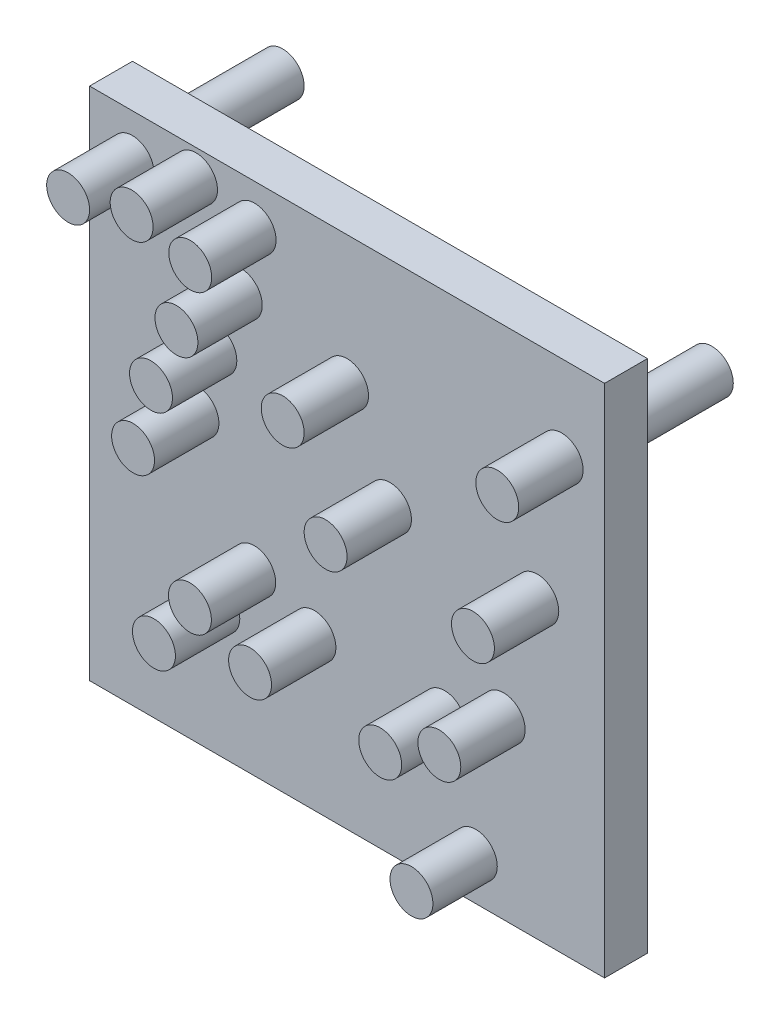
ISO-10303-21;
HEADER;
FILE_DESCRIPTION(('STEP AP214'),'2;1');
FILE_NAME('part.step','',(''),(''),'','','');
FILE_SCHEMA(('AUTOMOTIVE_DESIGN { 1 0 10303 214 1 1 1 1 }'));
ENDSEC;
DATA;
#1=APPLICATION_CONTEXT('core data for automotive mechanical design processes');
#2=APPLICATION_PROTOCOL_DEFINITION('international standard','automotive_design',2000,#1);
#3=PRODUCT_CONTEXT('',#1,'mechanical');
#4=PRODUCT('Part','Part','',(#3));
#5=PRODUCT_RELATED_PRODUCT_CATEGORY('part','',(#4));
#6=PRODUCT_DEFINITION_FORMATION('','',#4);
#7=PRODUCT_DEFINITION_CONTEXT('part definition',#1,'design');
#8=PRODUCT_DEFINITION('design','',#6,#7);
#9=PRODUCT_DEFINITION_SHAPE('','',#8);
#10=(LENGTH_UNIT() NAMED_UNIT(*) SI_UNIT(.MILLI.,.METRE.));
#11=(NAMED_UNIT(*) PLANE_ANGLE_UNIT() SI_UNIT($,.RADIAN.));
#12=(NAMED_UNIT(*) SI_UNIT($,.STERADIAN.) SOLID_ANGLE_UNIT());
#13=UNCERTAINTY_MEASURE_WITH_UNIT(LENGTH_MEASURE(1.E-05),#10,'distance_accuracy_value','');
#14=(GEOMETRIC_REPRESENTATION_CONTEXT(3) GLOBAL_UNCERTAINTY_ASSIGNED_CONTEXT((#13)) GLOBAL_UNIT_ASSIGNED_CONTEXT((#10,
#11,#12)) REPRESENTATION_CONTEXT('',''));
#15=CARTESIAN_POINT('',(0.,0.,0.));
#16=DIRECTION('',(0.,0.,1.));
#17=DIRECTION('',(1.,0.,0.));
#18=AXIS2_PLACEMENT_3D('',#15,#16,#17);
#19=CARTESIAN_POINT('',(0.,0.,10.));
#20=DIRECTION('',(0.,1.,0.));
#21=DIRECTION('',(0.,0.,1.));
#22=AXIS2_PLACEMENT_3D('',#19,#20,#21);
#23=PLANE('',#22);
#24=DIRECTION('',(1.,0.,0.));
#25=VECTOR('',#24,1.);
#26=CARTESIAN_POINT('',(0.,0.,0.));
#27=LINE('',#26,#25);
#28=CARTESIAN_POINT('',(-60.,0.,0.));
#29=VERTEX_POINT('',#28);
#30=CARTESIAN_POINT('',(60.,0.,0.));
#31=VERTEX_POINT('',#30);
#32=EDGE_CURVE('E112',#29,#31,#27,.T.);
#33=ORIENTED_EDGE('',*,*,#32,.T.);
#34=DIRECTION('',(0.,0.,-1.));
#35=VECTOR('',#34,1.);
#36=CARTESIAN_POINT('',(60.,0.,10.));
#37=LINE('',#36,#35);
#38=CARTESIAN_POINT('',(60.,0.,10.));
#39=VERTEX_POINT('',#38);
#40=EDGE_CURVE('E12',#39,#31,#37,.T.);
#41=ORIENTED_EDGE('',*,*,#40,.F.);
#42=DIRECTION('',(1.,0.,0.));
#43=VECTOR('',#42,1.);
#44=CARTESIAN_POINT('',(0.,0.,10.));
#45=LINE('',#44,#43);
#46=CARTESIAN_POINT('',(-60.,0.,10.));
#47=VERTEX_POINT('',#46);
#48=EDGE_CURVE('E94',#47,#39,#45,.T.);
#49=ORIENTED_EDGE('',*,*,#48,.F.);
#50=DIRECTION('',(0.,0.,-1.));
#51=VECTOR('',#50,1.);
#52=CARTESIAN_POINT('',(-60.,0.,10.));
#53=LINE('',#52,#51);
#54=EDGE_CURVE('E61',#47,#29,#53,.T.);
#55=ORIENTED_EDGE('',*,*,#54,.T.);
#56=EDGE_LOOP('',(#33,#41,#49,#55));
#57=FACE_BOUND('',#56,.T.);
#58=ADVANCED_FACE('F44',(#57),#23,.F.);
#59=CARTESIAN_POINT('',(60.,0.,10.));
#60=DIRECTION('',(-1.,0.,0.));
#61=DIRECTION('',(0.,-1.,0.));
#62=AXIS2_PLACEMENT_3D('',#59,#60,#61);
#63=PLANE('',#62);
#64=DIRECTION('',(0.,1.,0.));
#65=VECTOR('',#64,1.);
#66=CARTESIAN_POINT('',(60.,0.,0.));
#67=LINE('',#66,#65);
#68=CARTESIAN_POINT('',(60.,120.,0.));
#69=VERTEX_POINT('',#68);
#70=EDGE_CURVE('E100',#31,#69,#67,.T.);
#71=ORIENTED_EDGE('',*,*,#70,.T.);
#72=DIRECTION('',(0.,0.,-1.));
#73=VECTOR('',#72,1.);
#74=CARTESIAN_POINT('',(60.,120.,10.));
#75=LINE('',#74,#73);
#76=CARTESIAN_POINT('',(60.,120.,10.));
#77=VERTEX_POINT('',#76);
#78=EDGE_CURVE('E53',#77,#69,#75,.T.);
#79=ORIENTED_EDGE('',*,*,#78,.F.);
#80=DIRECTION('',(0.,1.,0.));
#81=VECTOR('',#80,1.);
#82=CARTESIAN_POINT('',(60.,0.,10.));
#83=LINE('',#82,#81);
#84=EDGE_CURVE('E86',#39,#77,#83,.T.);
#85=ORIENTED_EDGE('',*,*,#84,.F.);
#86=ORIENTED_EDGE('',*,*,#40,.T.);
#87=EDGE_LOOP('',(#71,#79,#85,#86));
#88=FACE_BOUND('',#87,.T.);
#89=ADVANCED_FACE('F99',(#88),#63,.F.);
#90=CARTESIAN_POINT('',(0.,120.,10.));
#91=DIRECTION('',(0.,1.,0.));
#92=DIRECTION('',(0.,0.,1.));
#93=AXIS2_PLACEMENT_3D('',#90,#91,#92);
#94=PLANE('',#93);
#95=DIRECTION('',(1.,0.,0.));
#96=VECTOR('',#95,1.);
#97=CARTESIAN_POINT('',(0.,120.,0.));
#98=LINE('',#97,#96);
#99=CARTESIAN_POINT('',(-60.,120.,0.));
#100=VERTEX_POINT('',#99);
#101=EDGE_CURVE('E118',#100,#69,#98,.T.);
#102=ORIENTED_EDGE('',*,*,#101,.F.);
#103=DIRECTION('',(0.,0.,-1.));
#104=VECTOR('',#103,1.);
#105=CARTESIAN_POINT('',(-60.,120.,10.));
#106=LINE('',#105,#104);
#107=CARTESIAN_POINT('',(-60.,120.,10.));
#108=VERTEX_POINT('',#107);
#109=EDGE_CURVE('E75',#108,#100,#106,.T.);
#110=ORIENTED_EDGE('',*,*,#109,.F.);
#111=DIRECTION('',(1.,0.,0.));
#112=VECTOR('',#111,1.);
#113=CARTESIAN_POINT('',(0.,120.,10.));
#114=LINE('',#113,#112);
#115=EDGE_CURVE('E93',#108,#77,#114,.T.);
#116=ORIENTED_EDGE('',*,*,#115,.T.);
#117=ORIENTED_EDGE('',*,*,#78,.T.);
#118=EDGE_LOOP('',(#102,#110,#116,#117));
#119=FACE_BOUND('',#118,.T.);
#120=ADVANCED_FACE('F104',(#119),#94,.T.);
#121=CARTESIAN_POINT('',(-60.,0.,10.));
#122=DIRECTION('',(-1.,0.,0.));
#123=DIRECTION('',(0.,0.,1.));
#124=AXIS2_PLACEMENT_3D('',#121,#122,#123);
#125=PLANE('',#124);
#126=DIRECTION('',(0.,1.,0.));
#127=VECTOR('',#126,1.);
#128=CARTESIAN_POINT('',(-60.,0.,0.));
#129=LINE('',#128,#127);
#130=EDGE_CURVE('E121',#29,#100,#129,.T.);
#131=ORIENTED_EDGE('',*,*,#130,.F.);
#132=ORIENTED_EDGE('',*,*,#54,.F.);
#133=DIRECTION('',(0.,1.,0.));
#134=VECTOR('',#133,1.);
#135=CARTESIAN_POINT('',(-60.,0.,10.));
#136=LINE('',#135,#134);
#137=EDGE_CURVE('E106',#47,#108,#136,.T.);
#138=ORIENTED_EDGE('',*,*,#137,.T.);
#139=ORIENTED_EDGE('',*,*,#109,.T.);
#140=EDGE_LOOP('',(#131,#132,#138,#139));
#141=FACE_BOUND('',#140,.T.);
#142=ADVANCED_FACE('F328',(#141),#125,.T.);
#143=CARTESIAN_POINT('',(0.,0.,10.));
#144=DIRECTION('',(0.,0.,1.));
#145=DIRECTION('',(1.,0.,0.));
#146=AXIS2_PLACEMENT_3D('',#143,#144,#145);
#147=PLANE('',#146);
#148=CARTESIAN_POINT('',(30.,10.,10.));
#149=DIRECTION('',(0.,0.,1.));
#150=DIRECTION('',(1.,0.,0.));
#151=AXIS2_PLACEMENT_3D('',#148,#149,#150);
#152=CIRCLE('',#151,5.);
#153=CARTESIAN_POINT('',(35.,10.,10.));
#154=VERTEX_POINT('',#153);
#155=EDGE_CURVE('E298',#154,#154,#152,.F.);
#156=ORIENTED_EDGE('',*,*,#155,.T.);
#157=EDGE_LOOP('',(#156));
#158=FACE_BOUND('',#157,.T.);
#159=CARTESIAN_POINT('',(-30.,30.,10.));
#160=DIRECTION('',(0.,0.,1.));
#161=DIRECTION('',(1.,0.,0.));
#162=AXIS2_PLACEMENT_3D('',#159,#160,#161);
#163=CIRCLE('',#162,5.);
#164=CARTESIAN_POINT('',(-25.,30.,10.));
#165=VERTEX_POINT('',#164);
#166=EDGE_CURVE('E290',#165,#165,#163,.F.);
#167=ORIENTED_EDGE('',*,*,#166,.T.);
#168=EDGE_LOOP('',(#167));
#169=FACE_BOUND('',#168,.T.);
#170=CARTESIAN_POINT('',(9.99999999999999,70.,10.));
#171=DIRECTION('',(0.,0.,1.));
#172=DIRECTION('',(1.,0.,0.));
#173=AXIS2_PLACEMENT_3D('',#170,#171,#172);
#174=CIRCLE('',#173,5.);
#175=CARTESIAN_POINT('',(15.,70.,10.));
#176=VERTEX_POINT('',#175);
#177=EDGE_CURVE('E282',#176,#176,#174,.F.);
#178=ORIENTED_EDGE('',*,*,#177,.T.);
#179=EDGE_LOOP('',(#178));
#180=FACE_BOUND('',#179,.T.);
#181=CARTESIAN_POINT('',(0.,90.,10.));
#182=DIRECTION('',(0.,0.,1.));
#183=DIRECTION('',(1.,0.,0.));
#184=AXIS2_PLACEMENT_3D('',#181,#182,#183);
#185=CIRCLE('',#184,5.);
#186=CARTESIAN_POINT('',(5.,90.,10.));
#187=VERTEX_POINT('',#186);
#188=EDGE_CURVE('E274',#187,#187,#185,.F.);
#189=ORIENTED_EDGE('',*,*,#188,.T.);
#190=EDGE_LOOP('',(#189));
#191=FACE_BOUND('',#190,.T.);
#192=CARTESIAN_POINT('',(50.,100.,10.));
#193=DIRECTION('',(0.,0.,1.));
#194=DIRECTION('',(1.,0.,0.));
#195=AXIS2_PLACEMENT_3D('',#192,#193,#194);
#196=CIRCLE('',#195,5.);
#197=CARTESIAN_POINT('',(55.,100.,10.));
#198=VERTEX_POINT('',#197);
#199=EDGE_CURVE('E263',#198,#198,#196,.F.);
#200=ORIENTED_EDGE('',*,*,#199,.T.);
#201=EDGE_LOOP('',(#200));
#202=FACE_BOUND('',#201,.T.);
#203=CARTESIAN_POINT('',(44.3298197100217,68.6697516132972,10.));
#204=DIRECTION('',(0.,0.,1.));
#205=DIRECTION('',(1.,0.,0.));
#206=AXIS2_PLACEMENT_3D('',#203,#204,#205);
#207=CIRCLE('',#206,5.);
#208=CARTESIAN_POINT('',(49.3298197100217,68.6697516132972,10.));
#209=VERTEX_POINT('',#208);
#210=EDGE_CURVE('E218',#209,#209,#207,.F.);
#211=ORIENTED_EDGE('',*,*,#210,.T.);
#212=EDGE_LOOP('',(#211));
#213=FACE_BOUND('',#212,.T.);
#214=CARTESIAN_POINT('',(36.4985126122183,40.8091264864685,10.));
#215=DIRECTION('',(0.,0.,1.));
#216=DIRECTION('',(1.,0.,0.));
#217=AXIS2_PLACEMENT_3D('',#214,#215,#216);
#218=CIRCLE('',#217,5.);
#219=CARTESIAN_POINT('',(41.4985126122183,40.8091264864685,10.));
#220=VERTEX_POINT('',#219);
#221=EDGE_CURVE('E210',#220,#220,#218,.F.);
#222=ORIENTED_EDGE('',*,*,#221,.T.);
#223=EDGE_LOOP('',(#222));
#224=FACE_BOUND('',#223,.T.);
#225=CARTESIAN_POINT('',(22.7242044659963,34.370237865555,10.));
#226=DIRECTION('',(0.,0.,1.));
#227=DIRECTION('',(1.,0.,0.));
#228=AXIS2_PLACEMENT_3D('',#225,#226,#227);
#229=CIRCLE('',#228,5.);
#230=CARTESIAN_POINT('',(27.7242044659963,34.370237865555,10.));
#231=VERTEX_POINT('',#230);
#232=EDGE_CURVE('E202',#231,#231,#229,.F.);
#233=ORIENTED_EDGE('',*,*,#232,.T.);
#234=EDGE_LOOP('',(#233));
#235=FACE_BOUND('',#234,.T.);
#236=CARTESIAN_POINT('',(-7.60428553656016,35.3574267709437,10.));
#237=DIRECTION('',(0.,0.,1.));
#238=DIRECTION('',(1.,0.,0.));
#239=AXIS2_PLACEMENT_3D('',#236,#237,#238);
#240=CIRCLE('',#239,5.);
#241=CARTESIAN_POINT('',(-2.60428553656016,35.3574267709437,10.));
#242=VERTEX_POINT('',#241);
#243=EDGE_CURVE('E194',#242,#242,#240,.F.);
#244=ORIENTED_EDGE('',*,*,#243,.T.);
#245=EDGE_LOOP('',(#244));
#246=FACE_BOUND('',#245,.T.);
#247=CARTESIAN_POINT('',(-21.6175660857106,41.4427877076755,10.));
#248=DIRECTION('',(0.,0.,1.));
#249=DIRECTION('',(1.,0.,0.));
#250=AXIS2_PLACEMENT_3D('',#247,#248,#249);
#251=CIRCLE('',#250,5.);
#252=CARTESIAN_POINT('',(-16.6175660857106,41.4427877076755,10.));
#253=VERTEX_POINT('',#252);
#254=EDGE_CURVE('E186',#253,#253,#251,.F.);
#255=ORIENTED_EDGE('',*,*,#254,.T.);
#256=EDGE_LOOP('',(#255));
#257=FACE_BOUND('',#256,.T.);
#258=CARTESIAN_POINT('',(-34.8661665493023,66.9958826532401,10.));
#259=DIRECTION('',(0.,0.,1.));
#260=DIRECTION('',(1.,0.,0.));
#261=AXIS2_PLACEMENT_3D('',#258,#259,#260);
#262=CIRCLE('',#261,5.);
#263=CARTESIAN_POINT('',(-29.8661665493023,66.9958826532401,10.));
#264=VERTEX_POINT('',#263);
#265=EDGE_CURVE('E178',#264,#264,#262,.F.);
#266=ORIENTED_EDGE('',*,*,#265,.T.);
#267=EDGE_LOOP('',(#266));
#268=FACE_BOUND('',#267,.T.);
#269=CARTESIAN_POINT('',(-30.6879393988327,81.7091684461313,10.));
#270=DIRECTION('',(0.,0.,1.));
#271=DIRECTION('',(1.,0.,0.));
#272=AXIS2_PLACEMENT_3D('',#269,#270,#271);
#273=CIRCLE('',#272,5.);
#274=CARTESIAN_POINT('',(-25.6879393988327,81.7091684461313,10.));
#275=VERTEX_POINT('',#274);
#276=EDGE_CURVE('E170',#275,#275,#273,.F.);
#277=ORIENTED_EDGE('',*,*,#276,.T.);
#278=EDGE_LOOP('',(#277));
#279=FACE_BOUND('',#278,.T.);
#280=CARTESIAN_POINT('',(-24.7616586979105,95.8463157387056,10.));
#281=DIRECTION('',(0.,0.,1.));
#282=DIRECTION('',(1.,0.,0.));
#283=AXIS2_PLACEMENT_3D('',#280,#281,#282);
#284=CIRCLE('',#283,5.);
#285=CARTESIAN_POINT('',(-19.7616586979105,95.8463157387056,10.));
#286=VERTEX_POINT('',#285);
#287=EDGE_CURVE('E162',#286,#286,#284,.F.);
#288=ORIENTED_EDGE('',*,*,#287,.T.);
#289=EDGE_LOOP('',(#288));
#290=FACE_BOUND('',#289,.T.);
#291=CARTESIAN_POINT('',(-21.5409169620148,110.590393391575,10.));
#292=DIRECTION('',(0.,0.,1.));
#293=DIRECTION('',(1.,0.,0.));
#294=AXIS2_PLACEMENT_3D('',#291,#292,#293);
#295=CIRCLE('',#294,5.);
#296=CARTESIAN_POINT('',(-16.5409169620148,110.590393391575,10.));
#297=VERTEX_POINT('',#296);
#298=EDGE_CURVE('E154',#297,#297,#295,.F.);
#299=ORIENTED_EDGE('',*,*,#298,.T.);
#300=EDGE_LOOP('',(#299));
#301=FACE_BOUND('',#300,.T.);
#302=CARTESIAN_POINT('',(-35.1957143398213,113.933430283722,10.));
#303=DIRECTION('',(0.,0.,1.));
#304=DIRECTION('',(1.,0.,0.));
#305=AXIS2_PLACEMENT_3D('',#302,#303,#304);
#306=CIRCLE('',#305,5.);
#307=CARTESIAN_POINT('',(-30.1957143398213,113.933430283722,10.));
#308=VERTEX_POINT('',#307);
#309=EDGE_CURVE('E143',#308,#308,#306,.F.);
#310=ORIENTED_EDGE('',*,*,#309,.T.);
#311=EDGE_LOOP('',(#310));
#312=FACE_BOUND('',#311,.T.);
#313=CARTESIAN_POINT('',(-50.,110.,10.));
#314=DIRECTION('',(0.,0.,1.));
#315=DIRECTION('',(1.,0.,0.));
#316=AXIS2_PLACEMENT_3D('',#313,#314,#315);
#317=CIRCLE('',#316,5.);
#318=CARTESIAN_POINT('',(-45.,110.,10.));
#319=VERTEX_POINT('',#318);
#320=EDGE_CURVE('E115',#319,#319,#317,.F.);
#321=ORIENTED_EDGE('',*,*,#320,.T.);
#322=EDGE_LOOP('',(#321));
#323=FACE_BOUND('',#322,.T.);
#324=ORIENTED_EDGE('',*,*,#48,.T.);
#325=ORIENTED_EDGE('',*,*,#84,.T.);
#326=ORIENTED_EDGE('',*,*,#115,.F.);
#327=ORIENTED_EDGE('',*,*,#137,.F.);
#328=EDGE_LOOP('',(#324,#325,#326,#327));
#329=FACE_BOUND('',#328,.T.);
#330=ADVANCED_FACE('F90',(#158,#169,#180,#191,#202,#213,#224,#235,#246,#257,#268,#279,#290,#301,
#312,#323,#329),#147,.T.);
#331=CARTESIAN_POINT('',(0.,0.,0.));
#332=DIRECTION('',(0.,0.,1.));
#333=DIRECTION('',(1.,0.,0.));
#334=AXIS2_PLACEMENT_3D('',#331,#332,#333);
#335=PLANE('',#334);
#336=CARTESIAN_POINT('',(30.,10.,0.));
#337=DIRECTION('',(0.,0.,1.));
#338=DIRECTION('',(1.,0.,0.));
#339=AXIS2_PLACEMENT_3D('',#336,#337,#338);
#340=CIRCLE('',#339,5.);
#341=CARTESIAN_POINT('',(35.,10.,0.));
#342=VERTEX_POINT('',#341);
#343=EDGE_CURVE('E259',#342,#342,#340,.T.);
#344=ORIENTED_EDGE('',*,*,#343,.T.);
#345=EDGE_LOOP('',(#344));
#346=FACE_BOUND('',#345,.T.);
#347=CARTESIAN_POINT('',(-30.,30.,0.));
#348=DIRECTION('',(0.,0.,1.));
#349=DIRECTION('',(1.,0.,0.));
#350=AXIS2_PLACEMENT_3D('',#347,#348,#349);
#351=CIRCLE('',#350,5.);
#352=CARTESIAN_POINT('',(-25.,30.,0.));
#353=VERTEX_POINT('',#352);
#354=EDGE_CURVE('E251',#353,#353,#351,.T.);
#355=ORIENTED_EDGE('',*,*,#354,.T.);
#356=EDGE_LOOP('',(#355));
#357=FACE_BOUND('',#356,.T.);
#358=CARTESIAN_POINT('',(9.99999999999999,70.,0.));
#359=DIRECTION('',(0.,0.,1.));
#360=DIRECTION('',(1.,0.,0.));
#361=AXIS2_PLACEMENT_3D('',#358,#359,#360);
#362=CIRCLE('',#361,5.);
#363=CARTESIAN_POINT('',(15.,70.,0.));
#364=VERTEX_POINT('',#363);
#365=EDGE_CURVE('E243',#364,#364,#362,.T.);
#366=ORIENTED_EDGE('',*,*,#365,.T.);
#367=EDGE_LOOP('',(#366));
#368=FACE_BOUND('',#367,.T.);
#369=CARTESIAN_POINT('',(0.,90.,0.));
#370=DIRECTION('',(0.,0.,1.));
#371=DIRECTION('',(1.,0.,0.));
#372=AXIS2_PLACEMENT_3D('',#369,#370,#371);
#373=CIRCLE('',#372,5.);
#374=CARTESIAN_POINT('',(4.99999999999999,90.,0.));
#375=VERTEX_POINT('',#374);
#376=EDGE_CURVE('E235',#375,#375,#373,.T.);
#377=ORIENTED_EDGE('',*,*,#376,.T.);
#378=EDGE_LOOP('',(#377));
#379=FACE_BOUND('',#378,.T.);
#380=CARTESIAN_POINT('',(50.,100.,0.));
#381=DIRECTION('',(0.,0.,1.));
#382=DIRECTION('',(1.,0.,0.));
#383=AXIS2_PLACEMENT_3D('',#380,#381,#382);
#384=CIRCLE('',#383,5.);
#385=CARTESIAN_POINT('',(55.,100.,0.));
#386=VERTEX_POINT('',#385);
#387=EDGE_CURVE('E227',#386,#386,#384,.T.);
#388=ORIENTED_EDGE('',*,*,#387,.T.);
#389=EDGE_LOOP('',(#388));
#390=FACE_BOUND('',#389,.T.);
#391=CARTESIAN_POINT('',(-50.,110.,0.));
#392=DIRECTION('',(0.,0.,1.));
#393=DIRECTION('',(1.,0.,0.));
#394=AXIS2_PLACEMENT_3D('',#391,#392,#393);
#395=CIRCLE('',#394,5.);
#396=CARTESIAN_POINT('',(-45.,110.,0.));
#397=VERTEX_POINT('',#396);
#398=EDGE_CURVE('E139',#397,#397,#395,.T.);
#399=ORIENTED_EDGE('',*,*,#398,.T.);
#400=EDGE_LOOP('',(#399));
#401=FACE_BOUND('',#400,.T.);
#402=ORIENTED_EDGE('',*,*,#32,.F.);
#403=ORIENTED_EDGE('',*,*,#130,.T.);
#404=ORIENTED_EDGE('',*,*,#101,.T.);
#405=ORIENTED_EDGE('',*,*,#70,.F.);
#406=EDGE_LOOP('',(#402,#403,#404,#405));
#407=FACE_BOUND('',#406,.T.);
#408=ADVANCED_FACE('F327',(#346,#357,#368,#379,#390,#401,#407),#335,.F.);
#409=CARTESIAN_POINT('',(-50.,110.,25.));
#410=DIRECTION('',(0.,0.,-1.));
#411=DIRECTION('',(-1.,0.,0.));
#412=AXIS2_PLACEMENT_3D('',#409,#410,#411);
#413=CYLINDRICAL_SURFACE('',#412,5.);
#414=ORIENTED_EDGE('',*,*,#320,.F.);
#415=EDGE_LOOP('',(#414));
#416=FACE_BOUND('',#415,.T.);
#417=CARTESIAN_POINT('',(-50.,110.,25.));
#418=DIRECTION('',(0.,0.,1.));
#419=DIRECTION('',(1.,0.,0.));
#420=AXIS2_PLACEMENT_3D('',#417,#418,#419);
#421=CIRCLE('',#420,5.);
#422=CARTESIAN_POINT('',(-45.,110.,25.));
#423=VERTEX_POINT('',#422);
#424=EDGE_CURVE('E134',#423,#423,#421,.T.);
#425=ORIENTED_EDGE('',*,*,#424,.F.);
#426=EDGE_LOOP('',(#425));
#427=FACE_BOUND('',#426,.T.);
#428=ADVANCED_FACE('F340',(#416,#427),#413,.T.);
#429=CARTESIAN_POINT('',(0.,0.,25.));
#430=DIRECTION('',(0.,0.,1.));
#431=DIRECTION('',(1.,0.,0.));
#432=AXIS2_PLACEMENT_3D('',#429,#430,#431);
#433=PLANE('',#432);
#434=ORIENTED_EDGE('',*,*,#424,.T.);
#435=EDGE_LOOP('',(#434));
#436=FACE_BOUND('',#435,.T.);
#437=ADVANCED_FACE('F345',(#436),#433,.T.);
#438=CARTESIAN_POINT('',(-50.,110.,-25.));
#439=DIRECTION('',(0.,0.,1.));
#440=DIRECTION('',(1.,0.,0.));
#441=AXIS2_PLACEMENT_3D('',#438,#439,#440);
#442=CYLINDRICAL_SURFACE('',#441,5.);
#443=CARTESIAN_POINT('',(-50.,110.,-25.));
#444=DIRECTION('',(0.,0.,1.));
#445=DIRECTION('',(1.,0.,0.));
#446=AXIS2_PLACEMENT_3D('',#443,#444,#445);
#447=CIRCLE('',#446,5.);
#448=CARTESIAN_POINT('',(-45.,110.,-25.));
#449=VERTEX_POINT('',#448);
#450=EDGE_CURVE('E138',#449,#449,#447,.T.);
#451=ORIENTED_EDGE('',*,*,#450,.T.);
#452=EDGE_LOOP('',(#451));
#453=FACE_BOUND('',#452,.T.);
#454=ORIENTED_EDGE('',*,*,#398,.F.);
#455=EDGE_LOOP('',(#454));
#456=FACE_BOUND('',#455,.T.);
#457=ADVANCED_FACE('F349',(#453,#456),#442,.T.);
#458=CARTESIAN_POINT('',(0.,0.,-25.));
#459=DIRECTION('',(0.,0.,-1.));
#460=DIRECTION('',(1.,0.,0.));
#461=AXIS2_PLACEMENT_3D('',#458,#459,#460);
#462=PLANE('',#461);
#463=ORIENTED_EDGE('',*,*,#450,.F.);
#464=EDGE_LOOP('',(#463));
#465=FACE_BOUND('',#464,.T.);
#466=ADVANCED_FACE('F353',(#465),#462,.T.);
#467=CARTESIAN_POINT('',(-35.1957143398213,113.933430283722,25.));
#468=DIRECTION('',(0.,0.,-1.));
#469=DIRECTION('',(-1.,0.,0.));
#470=AXIS2_PLACEMENT_3D('',#467,#468,#469);
#471=CYLINDRICAL_SURFACE('',#470,5.);
#472=ORIENTED_EDGE('',*,*,#309,.F.);
#473=EDGE_LOOP('',(#472));
#474=FACE_BOUND('',#473,.T.);
#475=CARTESIAN_POINT('',(-35.1957143398213,113.933430283722,25.));
#476=DIRECTION('',(0.,0.,1.));
#477=DIRECTION('',(1.,0.,0.));
#478=AXIS2_PLACEMENT_3D('',#475,#476,#477);
#479=CIRCLE('',#478,5.);
#480=CARTESIAN_POINT('',(-30.1957143398213,113.933430283722,25.));
#481=VERTEX_POINT('',#480);
#482=EDGE_CURVE('E150',#481,#481,#479,.T.);
#483=ORIENTED_EDGE('',*,*,#482,.F.);
#484=EDGE_LOOP('',(#483));
#485=FACE_BOUND('',#484,.T.);
#486=ADVANCED_FACE('F357',(#474,#485),#471,.T.);
#487=CARTESIAN_POINT('',(14.8042856601787,3.93343028372205,25.));
#488=DIRECTION('',(0.,0.,1.));
#489=DIRECTION('',(1.,0.,0.));
#490=AXIS2_PLACEMENT_3D('',#487,#488,#489);
#491=PLANE('',#490);
#492=ORIENTED_EDGE('',*,*,#482,.T.);
#493=EDGE_LOOP('',(#492));
#494=FACE_BOUND('',#493,.T.);
#495=ADVANCED_FACE('F361',(#494),#491,.T.);
#496=CARTESIAN_POINT('',(-21.5409169620148,110.590393391575,25.));
#497=DIRECTION('',(0.,0.,-1.));
#498=DIRECTION('',(-1.,0.,0.));
#499=AXIS2_PLACEMENT_3D('',#496,#497,#498);
#500=CYLINDRICAL_SURFACE('',#499,5.);
#501=ORIENTED_EDGE('',*,*,#298,.F.);
#502=EDGE_LOOP('',(#501));
#503=FACE_BOUND('',#502,.T.);
#504=CARTESIAN_POINT('',(-21.5409169620148,110.590393391575,25.));
#505=DIRECTION('',(0.,0.,1.));
#506=DIRECTION('',(1.,0.,0.));
#507=AXIS2_PLACEMENT_3D('',#504,#505,#506);
#508=CIRCLE('',#507,5.);
#509=CARTESIAN_POINT('',(-16.5409169620148,110.590393391575,25.));
#510=VERTEX_POINT('',#509);
#511=EDGE_CURVE('E158',#510,#510,#508,.T.);
#512=ORIENTED_EDGE('',*,*,#511,.F.);
#513=EDGE_LOOP('',(#512));
#514=FACE_BOUND('',#513,.T.);
#515=ADVANCED_FACE('F365',(#503,#514),#500,.T.);
#516=CARTESIAN_POINT('',(28.4590830379852,0.590393391575031,25.));
#517=DIRECTION('',(0.,0.,1.));
#518=DIRECTION('',(1.,0.,0.));
#519=AXIS2_PLACEMENT_3D('',#516,#517,#518);
#520=PLANE('',#519);
#521=ORIENTED_EDGE('',*,*,#511,.T.);
#522=EDGE_LOOP('',(#521));
#523=FACE_BOUND('',#522,.T.);
#524=ADVANCED_FACE('F369',(#523),#520,.T.);
#525=CARTESIAN_POINT('',(-24.7616586979105,95.8463157387056,25.));
#526=DIRECTION('',(0.,0.,-1.));
#527=DIRECTION('',(-1.,0.,0.));
#528=AXIS2_PLACEMENT_3D('',#525,#526,#527);
#529=CYLINDRICAL_SURFACE('',#528,5.);
#530=ORIENTED_EDGE('',*,*,#287,.F.);
#531=EDGE_LOOP('',(#530));
#532=FACE_BOUND('',#531,.T.);
#533=CARTESIAN_POINT('',(-24.7616586979105,95.8463157387056,25.));
#534=DIRECTION('',(0.,0.,1.));
#535=DIRECTION('',(1.,0.,0.));
#536=AXIS2_PLACEMENT_3D('',#533,#534,#535);
#537=CIRCLE('',#536,5.);
#538=CARTESIAN_POINT('',(-19.7616586979105,95.8463157387056,25.));
#539=VERTEX_POINT('',#538);
#540=EDGE_CURVE('E166',#539,#539,#537,.T.);
#541=ORIENTED_EDGE('',*,*,#540,.F.);
#542=EDGE_LOOP('',(#541));
#543=FACE_BOUND('',#542,.T.);
#544=ADVANCED_FACE('F373',(#532,#543),#529,.T.);
#545=CARTESIAN_POINT('',(25.2383413020895,-14.1536842612944,25.));
#546=DIRECTION('',(0.,0.,1.));
#547=DIRECTION('',(1.,0.,0.));
#548=AXIS2_PLACEMENT_3D('',#545,#546,#547);
#549=PLANE('',#548);
#550=ORIENTED_EDGE('',*,*,#540,.T.);
#551=EDGE_LOOP('',(#550));
#552=FACE_BOUND('',#551,.T.);
#553=ADVANCED_FACE('F377',(#552),#549,.T.);
#554=CARTESIAN_POINT('',(-30.6879393988327,81.7091684461313,25.));
#555=DIRECTION('',(0.,0.,-1.));
#556=DIRECTION('',(-1.,0.,0.));
#557=AXIS2_PLACEMENT_3D('',#554,#555,#556);
#558=CYLINDRICAL_SURFACE('',#557,5.);
#559=ORIENTED_EDGE('',*,*,#276,.F.);
#560=EDGE_LOOP('',(#559));
#561=FACE_BOUND('',#560,.T.);
#562=CARTESIAN_POINT('',(-30.6879393988327,81.7091684461313,25.));
#563=DIRECTION('',(0.,0.,1.));
#564=DIRECTION('',(1.,0.,0.));
#565=AXIS2_PLACEMENT_3D('',#562,#563,#564);
#566=CIRCLE('',#565,5.);
#567=CARTESIAN_POINT('',(-25.6879393988327,81.7091684461313,25.));
#568=VERTEX_POINT('',#567);
#569=EDGE_CURVE('E174',#568,#568,#566,.T.);
#570=ORIENTED_EDGE('',*,*,#569,.F.);
#571=EDGE_LOOP('',(#570));
#572=FACE_BOUND('',#571,.T.);
#573=ADVANCED_FACE('F381',(#561,#572),#558,.T.);
#574=CARTESIAN_POINT('',(19.3120606011673,-28.2908315538687,25.));
#575=DIRECTION('',(0.,0.,1.));
#576=DIRECTION('',(1.,0.,0.));
#577=AXIS2_PLACEMENT_3D('',#574,#575,#576);
#578=PLANE('',#577);
#579=ORIENTED_EDGE('',*,*,#569,.T.);
#580=EDGE_LOOP('',(#579));
#581=FACE_BOUND('',#580,.T.);
#582=ADVANCED_FACE('F385',(#581),#578,.T.);
#583=CARTESIAN_POINT('',(-34.8661665493023,66.9958826532401,25.));
#584=DIRECTION('',(0.,0.,-1.));
#585=DIRECTION('',(-1.,0.,0.));
#586=AXIS2_PLACEMENT_3D('',#583,#584,#585);
#587=CYLINDRICAL_SURFACE('',#586,5.);
#588=ORIENTED_EDGE('',*,*,#265,.F.);
#589=EDGE_LOOP('',(#588));
#590=FACE_BOUND('',#589,.T.);
#591=CARTESIAN_POINT('',(-34.8661665493023,66.9958826532401,25.));
#592=DIRECTION('',(0.,0.,1.));
#593=DIRECTION('',(1.,0.,0.));
#594=AXIS2_PLACEMENT_3D('',#591,#592,#593);
#595=CIRCLE('',#594,5.);
#596=CARTESIAN_POINT('',(-29.8661665493023,66.9958826532401,25.));
#597=VERTEX_POINT('',#596);
#598=EDGE_CURVE('E182',#597,#597,#595,.T.);
#599=ORIENTED_EDGE('',*,*,#598,.F.);
#600=EDGE_LOOP('',(#599));
#601=FACE_BOUND('',#600,.T.);
#602=ADVANCED_FACE('F389',(#590,#601),#587,.T.);
#603=CARTESIAN_POINT('',(15.1338334506977,-43.0041173467599,25.));
#604=DIRECTION('',(0.,0.,1.));
#605=DIRECTION('',(1.,0.,0.));
#606=AXIS2_PLACEMENT_3D('',#603,#604,#605);
#607=PLANE('',#606);
#608=ORIENTED_EDGE('',*,*,#598,.T.);
#609=EDGE_LOOP('',(#608));
#610=FACE_BOUND('',#609,.T.);
#611=ADVANCED_FACE('F393',(#610),#607,.T.);
#612=CARTESIAN_POINT('',(-21.6175660857106,41.4427877076755,25.));
#613=DIRECTION('',(0.,0.,-1.));
#614=DIRECTION('',(-1.,0.,0.));
#615=AXIS2_PLACEMENT_3D('',#612,#613,#614);
#616=CYLINDRICAL_SURFACE('',#615,5.);
#617=ORIENTED_EDGE('',*,*,#254,.F.);
#618=EDGE_LOOP('',(#617));
#619=FACE_BOUND('',#618,.T.);
#620=CARTESIAN_POINT('',(-21.6175660857106,41.4427877076755,25.));
#621=DIRECTION('',(0.,0.,1.));
#622=DIRECTION('',(1.,0.,0.));
#623=AXIS2_PLACEMENT_3D('',#620,#621,#622);
#624=CIRCLE('',#623,5.);
#625=CARTESIAN_POINT('',(-16.6175660857106,41.4427877076755,25.));
#626=VERTEX_POINT('',#625);
#627=EDGE_CURVE('E190',#626,#626,#624,.T.);
#628=ORIENTED_EDGE('',*,*,#627,.F.);
#629=EDGE_LOOP('',(#628));
#630=FACE_BOUND('',#629,.T.);
#631=ADVANCED_FACE('F397',(#619,#630),#616,.T.);
#632=CARTESIAN_POINT('',(28.3824339142894,-68.5572122923245,25.));
#633=DIRECTION('',(0.,0.,1.));
#634=DIRECTION('',(1.,0.,0.));
#635=AXIS2_PLACEMENT_3D('',#632,#633,#634);
#636=PLANE('',#635);
#637=ORIENTED_EDGE('',*,*,#627,.T.);
#638=EDGE_LOOP('',(#637));
#639=FACE_BOUND('',#638,.T.);
#640=ADVANCED_FACE('F401',(#639),#636,.T.);
#641=CARTESIAN_POINT('',(-7.60428553656016,35.3574267709437,25.));
#642=DIRECTION('',(0.,0.,-1.));
#643=DIRECTION('',(-1.,0.,0.));
#644=AXIS2_PLACEMENT_3D('',#641,#642,#643);
#645=CYLINDRICAL_SURFACE('',#644,5.);
#646=ORIENTED_EDGE('',*,*,#243,.F.);
#647=EDGE_LOOP('',(#646));
#648=FACE_BOUND('',#647,.T.);
#649=CARTESIAN_POINT('',(-7.60428553656016,35.3574267709437,25.));
#650=DIRECTION('',(0.,0.,1.));
#651=DIRECTION('',(1.,0.,0.));
#652=AXIS2_PLACEMENT_3D('',#649,#650,#651);
#653=CIRCLE('',#652,5.);
#654=CARTESIAN_POINT('',(-2.60428553656016,35.3574267709437,25.));
#655=VERTEX_POINT('',#654);
#656=EDGE_CURVE('E198',#655,#655,#653,.T.);
#657=ORIENTED_EDGE('',*,*,#656,.F.);
#658=EDGE_LOOP('',(#657));
#659=FACE_BOUND('',#658,.T.);
#660=ADVANCED_FACE('F405',(#648,#659),#645,.T.);
#661=CARTESIAN_POINT('',(42.3957144634398,-74.6425732290564,25.));
#662=DIRECTION('',(0.,0.,1.));
#663=DIRECTION('',(1.,0.,0.));
#664=AXIS2_PLACEMENT_3D('',#661,#662,#663);
#665=PLANE('',#664);
#666=ORIENTED_EDGE('',*,*,#656,.T.);
#667=EDGE_LOOP('',(#666));
#668=FACE_BOUND('',#667,.T.);
#669=ADVANCED_FACE('F409',(#668),#665,.T.);
#670=CARTESIAN_POINT('',(22.7242044659963,34.370237865555,25.));
#671=DIRECTION('',(0.,0.,-1.));
#672=DIRECTION('',(-1.,0.,0.));
#673=AXIS2_PLACEMENT_3D('',#670,#671,#672);
#674=CYLINDRICAL_SURFACE('',#673,5.);
#675=ORIENTED_EDGE('',*,*,#232,.F.);
#676=EDGE_LOOP('',(#675));
#677=FACE_BOUND('',#676,.T.);
#678=CARTESIAN_POINT('',(22.7242044659963,34.370237865555,25.));
#679=DIRECTION('',(0.,0.,1.));
#680=DIRECTION('',(1.,0.,0.));
#681=AXIS2_PLACEMENT_3D('',#678,#679,#680);
#682=CIRCLE('',#681,5.);
#683=CARTESIAN_POINT('',(27.7242044659963,34.370237865555,25.));
#684=VERTEX_POINT('',#683);
#685=EDGE_CURVE('E206',#684,#684,#682,.T.);
#686=ORIENTED_EDGE('',*,*,#685,.F.);
#687=EDGE_LOOP('',(#686));
#688=FACE_BOUND('',#687,.T.);
#689=ADVANCED_FACE('F413',(#677,#688),#674,.T.);
#690=CARTESIAN_POINT('',(72.7242044659963,-75.6297621344451,25.));
#691=DIRECTION('',(0.,0.,1.));
#692=DIRECTION('',(1.,0.,0.));
#693=AXIS2_PLACEMENT_3D('',#690,#691,#692);
#694=PLANE('',#693);
#695=ORIENTED_EDGE('',*,*,#685,.T.);
#696=EDGE_LOOP('',(#695));
#697=FACE_BOUND('',#696,.T.);
#698=ADVANCED_FACE('F417',(#697),#694,.T.);
#699=CARTESIAN_POINT('',(36.4985126122183,40.8091264864685,25.));
#700=DIRECTION('',(0.,0.,-1.));
#701=DIRECTION('',(-1.,0.,0.));
#702=AXIS2_PLACEMENT_3D('',#699,#700,#701);
#703=CYLINDRICAL_SURFACE('',#702,5.);
#704=ORIENTED_EDGE('',*,*,#221,.F.);
#705=EDGE_LOOP('',(#704));
#706=FACE_BOUND('',#705,.T.);
#707=CARTESIAN_POINT('',(36.4985126122183,40.8091264864685,25.));
#708=DIRECTION('',(0.,0.,1.));
#709=DIRECTION('',(1.,0.,0.));
#710=AXIS2_PLACEMENT_3D('',#707,#708,#709);
#711=CIRCLE('',#710,5.);
#712=CARTESIAN_POINT('',(41.4985126122183,40.8091264864685,25.));
#713=VERTEX_POINT('',#712);
#714=EDGE_CURVE('E214',#713,#713,#711,.T.);
#715=ORIENTED_EDGE('',*,*,#714,.F.);
#716=EDGE_LOOP('',(#715));
#717=FACE_BOUND('',#716,.T.);
#718=ADVANCED_FACE('F421',(#706,#717),#703,.T.);
#719=CARTESIAN_POINT('',(86.4985126122183,-69.1908735135315,25.));
#720=DIRECTION('',(0.,0.,1.));
#721=DIRECTION('',(1.,0.,0.));
#722=AXIS2_PLACEMENT_3D('',#719,#720,#721);
#723=PLANE('',#722);
#724=ORIENTED_EDGE('',*,*,#714,.T.);
#725=EDGE_LOOP('',(#724));
#726=FACE_BOUND('',#725,.T.);
#727=ADVANCED_FACE('F425',(#726),#723,.T.);
#728=CARTESIAN_POINT('',(44.3298197100217,68.6697516132972,25.));
#729=DIRECTION('',(0.,0.,-1.));
#730=DIRECTION('',(-1.,0.,0.));
#731=AXIS2_PLACEMENT_3D('',#728,#729,#730);
#732=CYLINDRICAL_SURFACE('',#731,5.);
#733=ORIENTED_EDGE('',*,*,#210,.F.);
#734=EDGE_LOOP('',(#733));
#735=FACE_BOUND('',#734,.T.);
#736=CARTESIAN_POINT('',(44.3298197100217,68.6697516132972,25.));
#737=DIRECTION('',(0.,0.,1.));
#738=DIRECTION('',(1.,0.,0.));
#739=AXIS2_PLACEMENT_3D('',#736,#737,#738);
#740=CIRCLE('',#739,5.);
#741=CARTESIAN_POINT('',(49.3298197100217,68.6697516132972,25.));
#742=VERTEX_POINT('',#741);
#743=EDGE_CURVE('E222',#742,#742,#740,.T.);
#744=ORIENTED_EDGE('',*,*,#743,.F.);
#745=EDGE_LOOP('',(#744));
#746=FACE_BOUND('',#745,.T.);
#747=ADVANCED_FACE('F429',(#735,#746),#732,.T.);
#748=CARTESIAN_POINT('',(94.3298197100217,-41.3302483867028,25.));
#749=DIRECTION('',(0.,0.,1.));
#750=DIRECTION('',(1.,0.,0.));
#751=AXIS2_PLACEMENT_3D('',#748,#749,#750);
#752=PLANE('',#751);
#753=ORIENTED_EDGE('',*,*,#743,.T.);
#754=EDGE_LOOP('',(#753));
#755=FACE_BOUND('',#754,.T.);
#756=ADVANCED_FACE('F433',(#755),#752,.T.);
#757=CARTESIAN_POINT('',(50.,100.,-25.));
#758=DIRECTION('',(0.,0.,1.));
#759=DIRECTION('',(1.,0.,0.));
#760=AXIS2_PLACEMENT_3D('',#757,#758,#759);
#761=CYLINDRICAL_SURFACE('',#760,5.);
#762=CARTESIAN_POINT('',(50.,100.,-25.));
#763=DIRECTION('',(0.,0.,1.));
#764=DIRECTION('',(1.,0.,0.));
#765=AXIS2_PLACEMENT_3D('',#762,#763,#764);
#766=CIRCLE('',#765,5.);
#767=CARTESIAN_POINT('',(55.,100.,-25.));
#768=VERTEX_POINT('',#767);
#769=EDGE_CURVE('E226',#768,#768,#766,.T.);
#770=ORIENTED_EDGE('',*,*,#769,.T.);
#771=EDGE_LOOP('',(#770));
#772=FACE_BOUND('',#771,.T.);
#773=ORIENTED_EDGE('',*,*,#387,.F.);
#774=EDGE_LOOP('',(#773));
#775=FACE_BOUND('',#774,.T.);
#776=ADVANCED_FACE('F437',(#772,#775),#761,.T.);
#777=CARTESIAN_POINT('',(100.,-9.99999999999999,-25.));
#778=DIRECTION('',(0.,0.,-1.));
#779=DIRECTION('',(1.,0.,0.));
#780=AXIS2_PLACEMENT_3D('',#777,#778,#779);
#781=PLANE('',#780);
#782=ORIENTED_EDGE('',*,*,#769,.F.);
#783=EDGE_LOOP('',(#782));
#784=FACE_BOUND('',#783,.T.);
#785=ADVANCED_FACE('F441',(#784),#781,.T.);
#786=CARTESIAN_POINT('',(0.,90.,-25.));
#787=DIRECTION('',(0.,0.,1.));
#788=DIRECTION('',(1.,0.,0.));
#789=AXIS2_PLACEMENT_3D('',#786,#787,#788);
#790=CYLINDRICAL_SURFACE('',#789,5.);
#791=CARTESIAN_POINT('',(0.,90.,-25.));
#792=DIRECTION('',(0.,0.,1.));
#793=DIRECTION('',(1.,0.,0.));
#794=AXIS2_PLACEMENT_3D('',#791,#792,#793);
#795=CIRCLE('',#794,5.);
#796=CARTESIAN_POINT('',(4.99999999999999,90.,-25.));
#797=VERTEX_POINT('',#796);
#798=EDGE_CURVE('E231',#797,#797,#795,.T.);
#799=ORIENTED_EDGE('',*,*,#798,.T.);
#800=EDGE_LOOP('',(#799));
#801=FACE_BOUND('',#800,.T.);
#802=ORIENTED_EDGE('',*,*,#376,.F.);
#803=EDGE_LOOP('',(#802));
#804=FACE_BOUND('',#803,.T.);
#805=ADVANCED_FACE('F445',(#801,#804),#790,.T.);
#806=CARTESIAN_POINT('',(50.,-20.,-25.));
#807=DIRECTION('',(0.,0.,-1.));
#808=DIRECTION('',(1.,0.,0.));
#809=AXIS2_PLACEMENT_3D('',#806,#807,#808);
#810=PLANE('',#809);
#811=ORIENTED_EDGE('',*,*,#798,.F.);
#812=EDGE_LOOP('',(#811));
#813=FACE_BOUND('',#812,.T.);
#814=ADVANCED_FACE('F449',(#813),#810,.T.);
#815=CARTESIAN_POINT('',(9.99999999999999,70.,-25.));
#816=DIRECTION('',(0.,0.,1.));
#817=DIRECTION('',(1.,0.,0.));
#818=AXIS2_PLACEMENT_3D('',#815,#816,#817);
#819=CYLINDRICAL_SURFACE('',#818,5.);
#820=CARTESIAN_POINT('',(9.99999999999999,70.,-25.));
#821=DIRECTION('',(0.,0.,1.));
#822=DIRECTION('',(1.,0.,0.));
#823=AXIS2_PLACEMENT_3D('',#820,#821,#822);
#824=CIRCLE('',#823,5.);
#825=CARTESIAN_POINT('',(15.,70.,-25.));
#826=VERTEX_POINT('',#825);
#827=EDGE_CURVE('E239',#826,#826,#824,.T.);
#828=ORIENTED_EDGE('',*,*,#827,.T.);
#829=EDGE_LOOP('',(#828));
#830=FACE_BOUND('',#829,.T.);
#831=ORIENTED_EDGE('',*,*,#365,.F.);
#832=EDGE_LOOP('',(#831));
#833=FACE_BOUND('',#832,.T.);
#834=ADVANCED_FACE('F453',(#830,#833),#819,.T.);
#835=CARTESIAN_POINT('',(60.,-40.,-25.));
#836=DIRECTION('',(0.,0.,-1.));
#837=DIRECTION('',(1.,0.,0.));
#838=AXIS2_PLACEMENT_3D('',#835,#836,#837);
#839=PLANE('',#838);
#840=ORIENTED_EDGE('',*,*,#827,.F.);
#841=EDGE_LOOP('',(#840));
#842=FACE_BOUND('',#841,.T.);
#843=ADVANCED_FACE('F457',(#842),#839,.T.);
#844=CARTESIAN_POINT('',(-30.,30.,-25.));
#845=DIRECTION('',(0.,0.,1.));
#846=DIRECTION('',(1.,0.,0.));
#847=AXIS2_PLACEMENT_3D('',#844,#845,#846);
#848=CYLINDRICAL_SURFACE('',#847,5.);
#849=CARTESIAN_POINT('',(-30.,30.,-25.));
#850=DIRECTION('',(0.,0.,1.));
#851=DIRECTION('',(1.,0.,0.));
#852=AXIS2_PLACEMENT_3D('',#849,#850,#851);
#853=CIRCLE('',#852,5.);
#854=CARTESIAN_POINT('',(-25.,30.,-25.));
#855=VERTEX_POINT('',#854);
#856=EDGE_CURVE('E247',#855,#855,#853,.T.);
#857=ORIENTED_EDGE('',*,*,#856,.T.);
#858=EDGE_LOOP('',(#857));
#859=FACE_BOUND('',#858,.T.);
#860=ORIENTED_EDGE('',*,*,#354,.F.);
#861=EDGE_LOOP('',(#860));
#862=FACE_BOUND('',#861,.T.);
#863=ADVANCED_FACE('F461',(#859,#862),#848,.T.);
#864=CARTESIAN_POINT('',(20.,-80.,-25.));
#865=DIRECTION('',(0.,0.,-1.));
#866=DIRECTION('',(1.,0.,0.));
#867=AXIS2_PLACEMENT_3D('',#864,#865,#866);
#868=PLANE('',#867);
#869=ORIENTED_EDGE('',*,*,#856,.F.);
#870=EDGE_LOOP('',(#869));
#871=FACE_BOUND('',#870,.T.);
#872=ADVANCED_FACE('F465',(#871),#868,.T.);
#873=CARTESIAN_POINT('',(30.,10.,-25.));
#874=DIRECTION('',(0.,0.,1.));
#875=DIRECTION('',(1.,0.,0.));
#876=AXIS2_PLACEMENT_3D('',#873,#874,#875);
#877=CYLINDRICAL_SURFACE('',#876,5.);
#878=CARTESIAN_POINT('',(30.,10.,-25.));
#879=DIRECTION('',(0.,0.,1.));
#880=DIRECTION('',(1.,0.,0.));
#881=AXIS2_PLACEMENT_3D('',#878,#879,#880);
#882=CIRCLE('',#881,5.);
#883=CARTESIAN_POINT('',(35.,10.,-25.));
#884=VERTEX_POINT('',#883);
#885=EDGE_CURVE('E255',#884,#884,#882,.T.);
#886=ORIENTED_EDGE('',*,*,#885,.T.);
#887=EDGE_LOOP('',(#886));
#888=FACE_BOUND('',#887,.T.);
#889=ORIENTED_EDGE('',*,*,#343,.F.);
#890=EDGE_LOOP('',(#889));
#891=FACE_BOUND('',#890,.T.);
#892=ADVANCED_FACE('F469',(#888,#891),#877,.T.);
#893=CARTESIAN_POINT('',(80.,-100.,-25.));
#894=DIRECTION('',(0.,0.,-1.));
#895=DIRECTION('',(1.,0.,0.));
#896=AXIS2_PLACEMENT_3D('',#893,#894,#895);
#897=PLANE('',#896);
#898=ORIENTED_EDGE('',*,*,#885,.F.);
#899=EDGE_LOOP('',(#898));
#900=FACE_BOUND('',#899,.T.);
#901=ADVANCED_FACE('F473',(#900),#897,.T.);
#902=CARTESIAN_POINT('',(50.,100.,25.));
#903=DIRECTION('',(0.,0.,-1.));
#904=DIRECTION('',(-1.,0.,0.));
#905=AXIS2_PLACEMENT_3D('',#902,#903,#904);
#906=CYLINDRICAL_SURFACE('',#905,5.);
#907=ORIENTED_EDGE('',*,*,#199,.F.);
#908=EDGE_LOOP('',(#907));
#909=FACE_BOUND('',#908,.T.);
#910=CARTESIAN_POINT('',(50.,100.,25.));
#911=DIRECTION('',(0.,0.,1.));
#912=DIRECTION('',(1.,0.,0.));
#913=AXIS2_PLACEMENT_3D('',#910,#911,#912);
#914=CIRCLE('',#913,5.);
#915=CARTESIAN_POINT('',(55.,100.,25.));
#916=VERTEX_POINT('',#915);
#917=EDGE_CURVE('E270',#916,#916,#914,.T.);
#918=ORIENTED_EDGE('',*,*,#917,.F.);
#919=EDGE_LOOP('',(#918));
#920=FACE_BOUND('',#919,.T.);
#921=ADVANCED_FACE('F477',(#909,#920),#906,.T.);
#922=CARTESIAN_POINT('',(100.,-9.99999999999999,25.));
#923=DIRECTION('',(0.,0.,1.));
#924=DIRECTION('',(1.,0.,0.));
#925=AXIS2_PLACEMENT_3D('',#922,#923,#924);
#926=PLANE('',#925);
#927=ORIENTED_EDGE('',*,*,#917,.T.);
#928=EDGE_LOOP('',(#927));
#929=FACE_BOUND('',#928,.T.);
#930=ADVANCED_FACE('F481',(#929),#926,.T.);
#931=CARTESIAN_POINT('',(0.,90.,25.));
#932=DIRECTION('',(0.,0.,-1.));
#933=DIRECTION('',(-1.,0.,0.));
#934=AXIS2_PLACEMENT_3D('',#931,#932,#933);
#935=CYLINDRICAL_SURFACE('',#934,5.);
#936=ORIENTED_EDGE('',*,*,#188,.F.);
#937=EDGE_LOOP('',(#936));
#938=FACE_BOUND('',#937,.T.);
#939=CARTESIAN_POINT('',(0.,90.,25.));
#940=DIRECTION('',(0.,0.,1.));
#941=DIRECTION('',(1.,0.,0.));
#942=AXIS2_PLACEMENT_3D('',#939,#940,#941);
#943=CIRCLE('',#942,5.);
#944=CARTESIAN_POINT('',(5.,90.,25.));
#945=VERTEX_POINT('',#944);
#946=EDGE_CURVE('E278',#945,#945,#943,.T.);
#947=ORIENTED_EDGE('',*,*,#946,.F.);
#948=EDGE_LOOP('',(#947));
#949=FACE_BOUND('',#948,.T.);
#950=ADVANCED_FACE('F485',(#938,#949),#935,.T.);
#951=CARTESIAN_POINT('',(50.,-20.,25.));
#952=DIRECTION('',(0.,0.,1.));
#953=DIRECTION('',(1.,0.,0.));
#954=AXIS2_PLACEMENT_3D('',#951,#952,#953);
#955=PLANE('',#954);
#956=ORIENTED_EDGE('',*,*,#946,.T.);
#957=EDGE_LOOP('',(#956));
#958=FACE_BOUND('',#957,.T.);
#959=ADVANCED_FACE('F489',(#958),#955,.T.);
#960=CARTESIAN_POINT('',(9.99999999999999,70.,25.));
#961=DIRECTION('',(0.,0.,-1.));
#962=DIRECTION('',(-1.,0.,0.));
#963=AXIS2_PLACEMENT_3D('',#960,#961,#962);
#964=CYLINDRICAL_SURFACE('',#963,5.);
#965=ORIENTED_EDGE('',*,*,#177,.F.);
#966=EDGE_LOOP('',(#965));
#967=FACE_BOUND('',#966,.T.);
#968=CARTESIAN_POINT('',(9.99999999999999,70.,25.));
#969=DIRECTION('',(0.,0.,1.));
#970=DIRECTION('',(1.,0.,0.));
#971=AXIS2_PLACEMENT_3D('',#968,#969,#970);
#972=CIRCLE('',#971,5.);
#973=CARTESIAN_POINT('',(15.,70.,25.));
#974=VERTEX_POINT('',#973);
#975=EDGE_CURVE('E286',#974,#974,#972,.T.);
#976=ORIENTED_EDGE('',*,*,#975,.F.);
#977=EDGE_LOOP('',(#976));
#978=FACE_BOUND('',#977,.T.);
#979=ADVANCED_FACE('F493',(#967,#978),#964,.T.);
#980=CARTESIAN_POINT('',(60.,-40.,25.));
#981=DIRECTION('',(0.,0.,1.));
#982=DIRECTION('',(1.,0.,0.));
#983=AXIS2_PLACEMENT_3D('',#980,#981,#982);
#984=PLANE('',#983);
#985=ORIENTED_EDGE('',*,*,#975,.T.);
#986=EDGE_LOOP('',(#985));
#987=FACE_BOUND('',#986,.T.);
#988=ADVANCED_FACE('F497',(#987),#984,.T.);
#989=CARTESIAN_POINT('',(-30.,30.,25.));
#990=DIRECTION('',(0.,0.,-1.));
#991=DIRECTION('',(-1.,0.,0.));
#992=AXIS2_PLACEMENT_3D('',#989,#990,#991);
#993=CYLINDRICAL_SURFACE('',#992,5.);
#994=ORIENTED_EDGE('',*,*,#166,.F.);
#995=EDGE_LOOP('',(#994));
#996=FACE_BOUND('',#995,.T.);
#997=CARTESIAN_POINT('',(-30.,30.,25.));
#998=DIRECTION('',(0.,0.,1.));
#999=DIRECTION('',(1.,0.,0.));
#1000=AXIS2_PLACEMENT_3D('',#997,#998,#999);
#1001=CIRCLE('',#1000,5.);
#1002=CARTESIAN_POINT('',(-25.,30.,25.));
#1003=VERTEX_POINT('',#1002);
#1004=EDGE_CURVE('E294',#1003,#1003,#1001,.T.);
#1005=ORIENTED_EDGE('',*,*,#1004,.F.);
#1006=EDGE_LOOP('',(#1005));
#1007=FACE_BOUND('',#1006,.T.);
#1008=ADVANCED_FACE('F319',(#996,#1007),#993,.T.);
#1009=CARTESIAN_POINT('',(20.,-80.,25.));
#1010=DIRECTION('',(0.,0.,1.));
#1011=DIRECTION('',(1.,0.,0.));
#1012=AXIS2_PLACEMENT_3D('',#1009,#1010,#1011);
#1013=PLANE('',#1012);
#1014=ORIENTED_EDGE('',*,*,#1004,.T.);
#1015=EDGE_LOOP('',(#1014));
#1016=FACE_BOUND('',#1015,.T.);
#1017=ADVANCED_FACE('F311',(#1016),#1013,.T.);
#1018=CARTESIAN_POINT('',(30.,10.,25.));
#1019=DIRECTION('',(0.,0.,-1.));
#1020=DIRECTION('',(-1.,0.,0.));
#1021=AXIS2_PLACEMENT_3D('',#1018,#1019,#1020);
#1022=CYLINDRICAL_SURFACE('',#1021,5.);
#1023=ORIENTED_EDGE('',*,*,#155,.F.);
#1024=EDGE_LOOP('',(#1023));
#1025=FACE_BOUND('',#1024,.T.);
#1026=CARTESIAN_POINT('',(30.,10.,25.));
#1027=DIRECTION('',(0.,0.,1.));
#1028=DIRECTION('',(1.,0.,0.));
#1029=AXIS2_PLACEMENT_3D('',#1026,#1027,#1028);
#1030=CIRCLE('',#1029,5.);
#1031=CARTESIAN_POINT('',(35.,10.,25.));
#1032=VERTEX_POINT('',#1031);
#1033=EDGE_CURVE('E302',#1032,#1032,#1030,.T.);
#1034=ORIENTED_EDGE('',*,*,#1033,.F.);
#1035=EDGE_LOOP('',(#1034));
#1036=FACE_BOUND('',#1035,.T.);
#1037=ADVANCED_FACE('F309',(#1025,#1036),#1022,.T.);
#1038=CARTESIAN_POINT('',(80.,-100.,25.));
#1039=DIRECTION('',(0.,0.,1.));
#1040=DIRECTION('',(1.,0.,0.));
#1041=AXIS2_PLACEMENT_3D('',#1038,#1039,#1040);
#1042=PLANE('',#1041);
#1043=ORIENTED_EDGE('',*,*,#1033,.T.);
#1044=EDGE_LOOP('',(#1043));
#1045=FACE_BOUND('',#1044,.T.);
#1046=ADVANCED_FACE('F307',(#1045),#1042,.T.);
#1047=CLOSED_SHELL('',(#58,#89,#120,#142,#330,#408,#428,#437,#457,#466,#486,#495,#515,#524,#544,
#553,#573,#582,#602,#611,#631,#640,#660,#669,#689,#698,#718,#727,#747,#756,#776,#785,#805,#814,
#834,#843,#863,#872,#892,#901,#921,#930,#950,#959,#979,#988,#1008,#1017,#1037,#1046));
#1048=MANIFOLD_SOLID_BREP('B2',#1047);
#1049=ADVANCED_BREP_SHAPE_REPRESENTATION('',(#18,#1048),#14);
#1050=SHAPE_DEFINITION_REPRESENTATION(#9,#1049);
ENDSEC;
END-ISO-10303-21;
